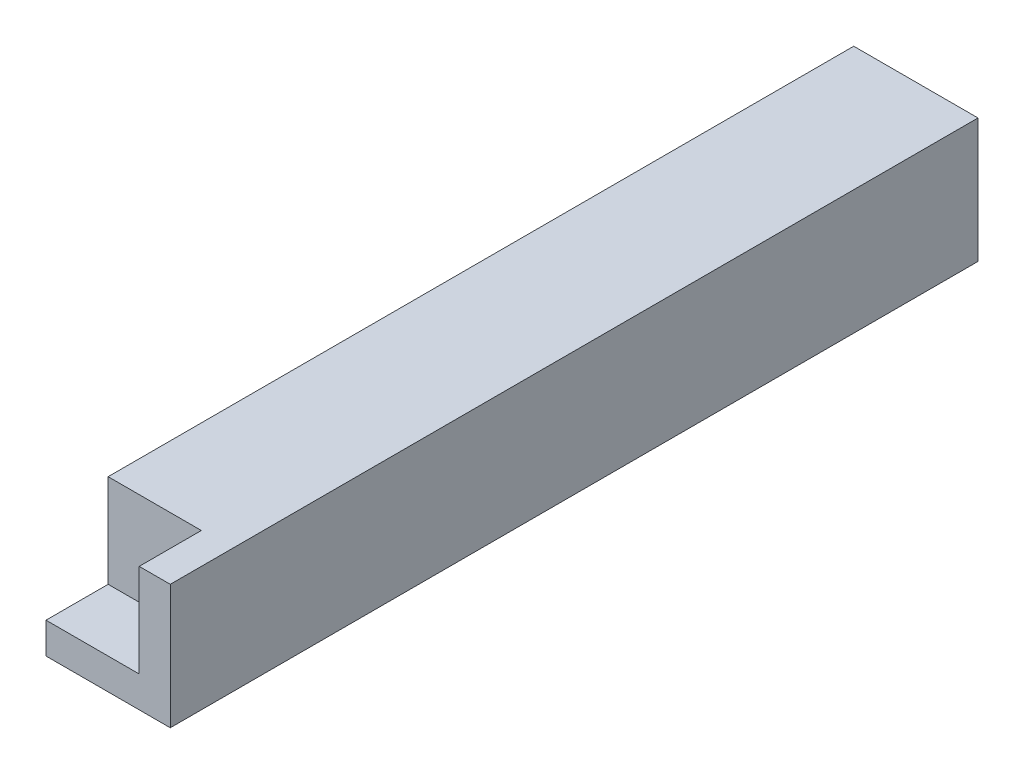
ISO-10303-21;
HEADER;
FILE_DESCRIPTION(('STEP AP214'),'2;1');
FILE_NAME('part.step','',(''),(''),'','','');
FILE_SCHEMA(('AUTOMOTIVE_DESIGN { 1 0 10303 214 1 1 1 1 }'));
ENDSEC;
DATA;
#1=APPLICATION_CONTEXT('core data for automotive mechanical design processes');
#2=APPLICATION_PROTOCOL_DEFINITION('international standard','automotive_design',2000,#1);
#3=PRODUCT_CONTEXT('',#1,'mechanical');
#4=PRODUCT('Part','Part','',(#3));
#5=PRODUCT_RELATED_PRODUCT_CATEGORY('part','',(#4));
#6=PRODUCT_DEFINITION_FORMATION('','',#4);
#7=PRODUCT_DEFINITION_CONTEXT('part definition',#1,'design');
#8=PRODUCT_DEFINITION('design','',#6,#7);
#9=PRODUCT_DEFINITION_SHAPE('','',#8);
#10=(LENGTH_UNIT() NAMED_UNIT(*) SI_UNIT(.MILLI.,.METRE.));
#11=(NAMED_UNIT(*) PLANE_ANGLE_UNIT() SI_UNIT($,.RADIAN.));
#12=(NAMED_UNIT(*) SI_UNIT($,.STERADIAN.) SOLID_ANGLE_UNIT());
#13=UNCERTAINTY_MEASURE_WITH_UNIT(LENGTH_MEASURE(1.E-05),#10,'distance_accuracy_value','');
#14=(GEOMETRIC_REPRESENTATION_CONTEXT(3) GLOBAL_UNCERTAINTY_ASSIGNED_CONTEXT((#13)) GLOBAL_UNIT_ASSIGNED_CONTEXT((#10,
#11,#12)) REPRESENTATION_CONTEXT('',''));
#15=CARTESIAN_POINT('',(0.,0.,0.));
#16=DIRECTION('',(0.,0.,1.));
#17=DIRECTION('',(1.,0.,0.));
#18=AXIS2_PLACEMENT_3D('',#15,#16,#17);
#19=CARTESIAN_POINT('',(-16.8292682926829,4.02439024390244,65.));
#20=DIRECTION('',(1.,0.,0.));
#21=DIRECTION('',(0.,1.,0.));
#22=AXIS2_PLACEMENT_3D('',#19,#20,#21);
#23=PLANE('',#22);
#24=DIRECTION('',(0.,0.,1.));
#25=VECTOR('',#24,1.);
#26=CARTESIAN_POINT('',(-16.8292682926829,-3.47560975609756,60.));
#27=LINE('',#26,#25);
#28=CARTESIAN_POINT('',(-16.8292682926829,-3.47560975609756,60.));
#29=VERTEX_POINT('',#28);
#30=CARTESIAN_POINT('',(-16.8292682926829,-3.47560975609756,65.));
#31=VERTEX_POINT('',#30);
#32=EDGE_CURVE('E140',#29,#31,#27,.T.);
#33=ORIENTED_EDGE('',*,*,#32,.F.);
#34=DIRECTION('',(0.,-1.,0.));
#35=VECTOR('',#34,1.);
#36=CARTESIAN_POINT('',(-16.8292682926829,0.,60.));
#37=LINE('',#36,#35);
#38=CARTESIAN_POINT('',(-16.8292682926829,4.02439024390244,60.));
#39=VERTEX_POINT('',#38);
#40=EDGE_CURVE('E115',#39,#29,#37,.T.);
#41=ORIENTED_EDGE('',*,*,#40,.F.);
#42=DIRECTION('',(0.,0.,-1.));
#43=VECTOR('',#42,1.);
#44=CARTESIAN_POINT('',(-16.8292682926829,4.02439024390244,65.));
#45=LINE('',#44,#43);
#46=CARTESIAN_POINT('',(-16.8292682926829,4.02439024390244,0.));
#47=VERTEX_POINT('',#46);
#48=EDGE_CURVE('E84',#39,#47,#45,.T.);
#49=ORIENTED_EDGE('',*,*,#48,.T.);
#50=DIRECTION('',(0.,-1.,0.));
#51=VECTOR('',#50,1.);
#52=CARTESIAN_POINT('',(-16.8292682926829,4.02439024390244,0.));
#53=LINE('',#52,#51);
#54=CARTESIAN_POINT('',(-16.8292682926829,-5.97560975609756,0.));
#55=VERTEX_POINT('',#54);
#56=EDGE_CURVE('E143',#47,#55,#53,.T.);
#57=ORIENTED_EDGE('',*,*,#56,.T.);
#58=DIRECTION('',(0.,0.,-1.));
#59=VECTOR('',#58,1.);
#60=CARTESIAN_POINT('',(-16.8292682926829,-5.97560975609756,65.));
#61=LINE('',#60,#59);
#62=CARTESIAN_POINT('',(-16.8292682926829,-5.97560975609756,65.));
#63=VERTEX_POINT('',#62);
#64=EDGE_CURVE('E11',#63,#55,#61,.T.);
#65=ORIENTED_EDGE('',*,*,#64,.F.);
#66=DIRECTION('',(0.,-1.,0.));
#67=VECTOR('',#66,1.);
#68=CARTESIAN_POINT('',(-16.8292682926829,4.02439024390244,65.));
#69=LINE('',#68,#67);
#70=EDGE_CURVE('E88',#31,#63,#69,.T.);
#71=ORIENTED_EDGE('',*,*,#70,.F.);
#72=EDGE_LOOP('',(#33,#41,#49,#57,#65,#71));
#73=FACE_BOUND('',#72,.T.);
#74=ADVANCED_FACE('F39',(#73),#23,.F.);
#75=CARTESIAN_POINT('',(0.,0.,65.));
#76=DIRECTION('',(0.,0.,1.));
#77=DIRECTION('',(1.,0.,0.));
#78=AXIS2_PLACEMENT_3D('',#75,#76,#77);
#79=PLANE('',#78);
#80=DIRECTION('',(0.,1.,0.));
#81=VECTOR('',#80,1.);
#82=CARTESIAN_POINT('',(-9.32926829268293,0.,65.));
#83=LINE('',#82,#81);
#84=CARTESIAN_POINT('',(-9.32926829268293,-3.47560975609756,65.));
#85=VERTEX_POINT('',#84);
#86=CARTESIAN_POINT('',(-9.32926829268293,4.02439024390244,65.));
#87=VERTEX_POINT('',#86);
#88=EDGE_CURVE('E124',#85,#87,#83,.T.);
#89=ORIENTED_EDGE('',*,*,#88,.F.);
#90=DIRECTION('',(-1.,0.,0.));
#91=VECTOR('',#90,1.);
#92=CARTESIAN_POINT('',(0.,-3.47560975609756,65.));
#93=LINE('',#92,#91);
#94=EDGE_CURVE('E54',#85,#31,#93,.T.);
#95=ORIENTED_EDGE('',*,*,#94,.T.);
#96=ORIENTED_EDGE('',*,*,#70,.T.);
#97=DIRECTION('',(1.,0.,0.));
#98=VECTOR('',#97,1.);
#99=CARTESIAN_POINT('',(-16.8292682926829,-5.97560975609756,65.));
#100=LINE('',#99,#98);
#101=CARTESIAN_POINT('',(-6.82926829268292,-5.97560975609756,65.));
#102=VERTEX_POINT('',#101);
#103=EDGE_CURVE('E148',#63,#102,#100,.T.);
#104=ORIENTED_EDGE('',*,*,#103,.T.);
#105=DIRECTION('',(0.,1.,0.));
#106=VECTOR('',#105,1.);
#107=CARTESIAN_POINT('',(-6.82926829268293,4.02439024390244,65.));
#108=LINE('',#107,#106);
#109=CARTESIAN_POINT('',(-6.82926829268293,4.02439024390244,65.));
#110=VERTEX_POINT('',#109);
#111=EDGE_CURVE('E63',#102,#110,#108,.T.);
#112=ORIENTED_EDGE('',*,*,#111,.T.);
#113=DIRECTION('',(-1.,0.,0.));
#114=VECTOR('',#113,1.);
#115=CARTESIAN_POINT('',(-16.8292682926829,4.02439024390244,65.));
#116=LINE('',#115,#114);
#117=EDGE_CURVE('E154',#110,#87,#116,.T.);
#118=ORIENTED_EDGE('',*,*,#117,.T.);
#119=EDGE_LOOP('',(#89,#95,#96,#104,#112,#118));
#120=FACE_BOUND('',#119,.T.);
#121=ADVANCED_FACE('F186',(#120),#79,.T.);
#122=CARTESIAN_POINT('',(-16.8292682926829,-5.97560975609756,65.));
#123=DIRECTION('',(0.,1.,0.));
#124=DIRECTION('',(0.,0.,1.));
#125=AXIS2_PLACEMENT_3D('',#122,#123,#124);
#126=PLANE('',#125);
#127=DIRECTION('',(1.,0.,0.));
#128=VECTOR('',#127,1.);
#129=CARTESIAN_POINT('',(-16.8292682926829,-5.97560975609756,0.));
#130=LINE('',#129,#128);
#131=CARTESIAN_POINT('',(-6.82926829268292,-5.97560975609756,0.));
#132=VERTEX_POINT('',#131);
#133=EDGE_CURVE('E159',#55,#132,#130,.T.);
#134=ORIENTED_EDGE('',*,*,#133,.T.);
#135=DIRECTION('',(0.,0.,-1.));
#136=VECTOR('',#135,1.);
#137=CARTESIAN_POINT('',(-6.82926829268292,-5.97560975609756,65.));
#138=LINE('',#137,#136);
#139=EDGE_CURVE('E47',#102,#132,#138,.T.);
#140=ORIENTED_EDGE('',*,*,#139,.F.);
#141=ORIENTED_EDGE('',*,*,#103,.F.);
#142=ORIENTED_EDGE('',*,*,#64,.T.);
#143=EDGE_LOOP('',(#134,#140,#141,#142));
#144=FACE_BOUND('',#143,.T.);
#145=ADVANCED_FACE('F188',(#144),#126,.F.);
#146=CARTESIAN_POINT('',(-6.82926829268293,4.02439024390244,65.));
#147=DIRECTION('',(-1.,0.,0.));
#148=DIRECTION('',(0.,-1.,0.));
#149=AXIS2_PLACEMENT_3D('',#146,#147,#148);
#150=PLANE('',#149);
#151=DIRECTION('',(0.,1.,0.));
#152=VECTOR('',#151,1.);
#153=CARTESIAN_POINT('',(-6.82926829268293,4.02439024390244,0.));
#154=LINE('',#153,#152);
#155=CARTESIAN_POINT('',(-6.82926829268293,4.02439024390244,0.));
#156=VERTEX_POINT('',#155);
#157=EDGE_CURVE('E162',#132,#156,#154,.T.);
#158=ORIENTED_EDGE('',*,*,#157,.T.);
#159=DIRECTION('',(0.,0.,-1.));
#160=VECTOR('',#159,1.);
#161=CARTESIAN_POINT('',(-6.82926829268293,4.02439024390244,65.));
#162=LINE('',#161,#160);
#163=EDGE_CURVE('E169',#110,#156,#162,.T.);
#164=ORIENTED_EDGE('',*,*,#163,.F.);
#165=ORIENTED_EDGE('',*,*,#111,.F.);
#166=ORIENTED_EDGE('',*,*,#139,.T.);
#167=EDGE_LOOP('',(#158,#164,#165,#166));
#168=FACE_BOUND('',#167,.T.);
#169=ADVANCED_FACE('F177',(#168),#150,.F.);
#170=CARTESIAN_POINT('',(-16.8292682926829,4.02439024390244,65.));
#171=DIRECTION('',(0.,-1.,0.));
#172=DIRECTION('',(0.,0.,-1.));
#173=AXIS2_PLACEMENT_3D('',#170,#171,#172);
#174=PLANE('',#173);
#175=DIRECTION('',(-1.,0.,0.));
#176=VECTOR('',#175,1.);
#177=CARTESIAN_POINT('',(0.,4.02439024390244,60.));
#178=LINE('',#177,#176);
#179=CARTESIAN_POINT('',(-9.32926829268293,4.02439024390244,60.));
#180=VERTEX_POINT('',#179);
#181=EDGE_CURVE('E129',#180,#39,#178,.T.);
#182=ORIENTED_EDGE('',*,*,#181,.F.);
#183=DIRECTION('',(0.,0.,1.));
#184=VECTOR('',#183,1.);
#185=CARTESIAN_POINT('',(-9.32926829268293,4.02439024390244,60.));
#186=LINE('',#185,#184);
#187=EDGE_CURVE('E114',#180,#87,#186,.T.);
#188=ORIENTED_EDGE('',*,*,#187,.T.);
#189=ORIENTED_EDGE('',*,*,#117,.F.);
#190=ORIENTED_EDGE('',*,*,#163,.T.);
#191=DIRECTION('',(-1.,0.,0.));
#192=VECTOR('',#191,1.);
#193=CARTESIAN_POINT('',(-16.8292682926829,4.02439024390244,0.));
#194=LINE('',#193,#192);
#195=EDGE_CURVE('E149',#156,#47,#194,.T.);
#196=ORIENTED_EDGE('',*,*,#195,.T.);
#197=ORIENTED_EDGE('',*,*,#48,.F.);
#198=EDGE_LOOP('',(#182,#188,#189,#190,#196,#197));
#199=FACE_BOUND('',#198,.T.);
#200=ADVANCED_FACE('F184',(#199),#174,.F.);
#201=CARTESIAN_POINT('',(0.,0.,0.));
#202=DIRECTION('',(0.,0.,1.));
#203=DIRECTION('',(1.,0.,0.));
#204=AXIS2_PLACEMENT_3D('',#201,#202,#203);
#205=PLANE('',#204);
#206=ORIENTED_EDGE('',*,*,#56,.F.);
#207=ORIENTED_EDGE('',*,*,#195,.F.);
#208=ORIENTED_EDGE('',*,*,#157,.F.);
#209=ORIENTED_EDGE('',*,*,#133,.F.);
#210=EDGE_LOOP('',(#206,#207,#208,#209));
#211=FACE_BOUND('',#210,.T.);
#212=ADVANCED_FACE('F182',(#211),#205,.F.);
#213=CARTESIAN_POINT('',(0.,-3.47560975609756,60.));
#214=DIRECTION('',(0.,1.,0.));
#215=DIRECTION('',(0.,0.,1.));
#216=AXIS2_PLACEMENT_3D('',#213,#214,#215);
#217=PLANE('',#216);
#218=ORIENTED_EDGE('',*,*,#94,.F.);
#219=DIRECTION('',(0.,0.,1.));
#220=VECTOR('',#219,1.);
#221=CARTESIAN_POINT('',(-9.32926829268292,-3.47560975609756,60.));
#222=LINE('',#221,#220);
#223=CARTESIAN_POINT('',(-9.32926829268292,-3.47560975609756,60.));
#224=VERTEX_POINT('',#223);
#225=EDGE_CURVE('E105',#224,#85,#222,.T.);
#226=ORIENTED_EDGE('',*,*,#225,.F.);
#227=DIRECTION('',(-1.,0.,0.));
#228=VECTOR('',#227,1.);
#229=CARTESIAN_POINT('',(0.,-3.47560975609756,60.));
#230=LINE('',#229,#228);
#231=EDGE_CURVE('E108',#224,#29,#230,.T.);
#232=ORIENTED_EDGE('',*,*,#231,.T.);
#233=ORIENTED_EDGE('',*,*,#32,.T.);
#234=EDGE_LOOP('',(#218,#226,#232,#233));
#235=FACE_BOUND('',#234,.T.);
#236=ADVANCED_FACE('F107',(#235),#217,.T.);
#237=CARTESIAN_POINT('',(-9.32926829268293,0.,60.));
#238=DIRECTION('',(1.,0.,0.));
#239=DIRECTION('',(0.,0.,-1.));
#240=AXIS2_PLACEMENT_3D('',#237,#238,#239);
#241=PLANE('',#240);
#242=ORIENTED_EDGE('',*,*,#88,.T.);
#243=ORIENTED_EDGE('',*,*,#187,.F.);
#244=DIRECTION('',(0.,1.,0.));
#245=VECTOR('',#244,1.);
#246=CARTESIAN_POINT('',(-9.32926829268293,0.,60.));
#247=LINE('',#246,#245);
#248=EDGE_CURVE('E120',#224,#180,#247,.T.);
#249=ORIENTED_EDGE('',*,*,#248,.F.);
#250=ORIENTED_EDGE('',*,*,#225,.T.);
#251=EDGE_LOOP('',(#242,#243,#249,#250));
#252=FACE_BOUND('',#251,.T.);
#253=ADVANCED_FACE('F126',(#252),#241,.F.);
#254=CARTESIAN_POINT('',(0.,0.,60.));
#255=DIRECTION('',(0.,0.,1.));
#256=DIRECTION('',(1.,0.,0.));
#257=AXIS2_PLACEMENT_3D('',#254,#255,#256);
#258=PLANE('',#257);
#259=ORIENTED_EDGE('',*,*,#231,.F.);
#260=ORIENTED_EDGE('',*,*,#248,.T.);
#261=ORIENTED_EDGE('',*,*,#181,.T.);
#262=ORIENTED_EDGE('',*,*,#40,.T.);
#263=EDGE_LOOP('',(#259,#260,#261,#262));
#264=FACE_BOUND('',#263,.T.);
#265=ADVANCED_FACE('F119',(#264),#258,.T.);
#266=CLOSED_SHELL('',(#74,#121,#145,#169,#200,#212,#236,#253,#265));
#267=MANIFOLD_SOLID_BREP('B2',#266);
#268=ADVANCED_BREP_SHAPE_REPRESENTATION('',(#18,#267),#14);
#269=SHAPE_DEFINITION_REPRESENTATION(#9,#268);
ENDSEC;
END-ISO-10303-21;
